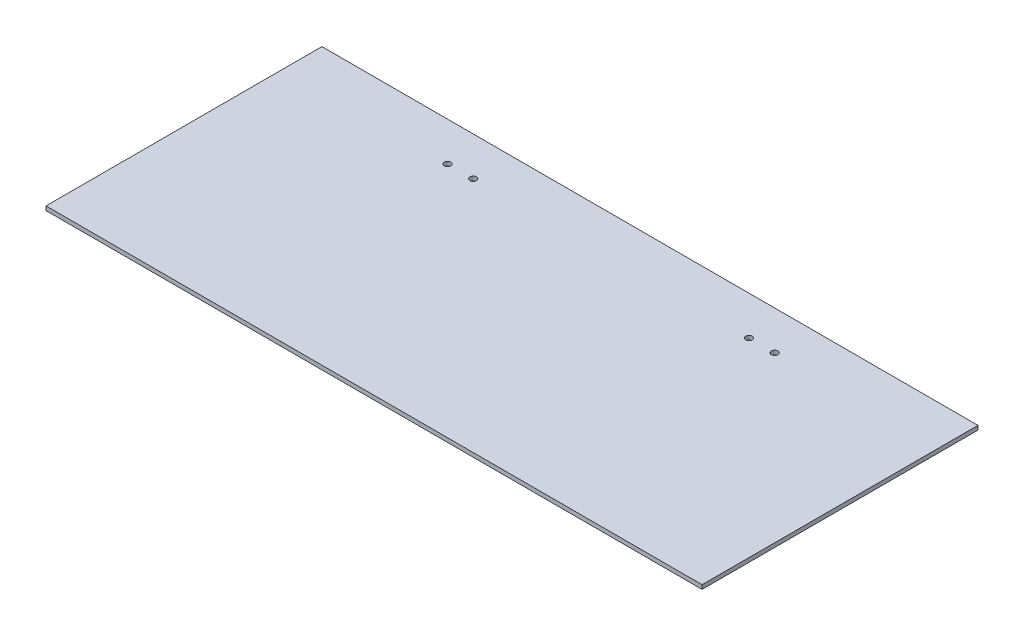
ISO-10303-21;
HEADER;
FILE_DESCRIPTION(('STEP AP214'),'2;1');
FILE_NAME('part.step','',(''),(''),'','','');
FILE_SCHEMA(('AUTOMOTIVE_DESIGN { 1 0 10303 214 1 1 1 1 }'));
ENDSEC;
DATA;
#1=APPLICATION_CONTEXT('core data for automotive mechanical design processes');
#2=APPLICATION_PROTOCOL_DEFINITION('international standard','automotive_design',2000,#1);
#3=PRODUCT_CONTEXT('',#1,'mechanical');
#4=PRODUCT('Part','Part','',(#3));
#5=PRODUCT_RELATED_PRODUCT_CATEGORY('part','',(#4));
#6=PRODUCT_DEFINITION_FORMATION('','',#4);
#7=PRODUCT_DEFINITION_CONTEXT('part definition',#1,'design');
#8=PRODUCT_DEFINITION('design','',#6,#7);
#9=PRODUCT_DEFINITION_SHAPE('','',#8);
#10=(LENGTH_UNIT() NAMED_UNIT(*) SI_UNIT(.MILLI.,.METRE.));
#11=(NAMED_UNIT(*) PLANE_ANGLE_UNIT() SI_UNIT($,.RADIAN.));
#12=(NAMED_UNIT(*) SI_UNIT($,.STERADIAN.) SOLID_ANGLE_UNIT());
#13=UNCERTAINTY_MEASURE_WITH_UNIT(LENGTH_MEASURE(1.E-05),#10,'distance_accuracy_value','');
#14=(GEOMETRIC_REPRESENTATION_CONTEXT(3) GLOBAL_UNCERTAINTY_ASSIGNED_CONTEXT((#13)) GLOBAL_UNIT_ASSIGNED_CONTEXT((#10,
#11,#12)) REPRESENTATION_CONTEXT('',''));
#15=CARTESIAN_POINT('',(0.,0.,0.));
#16=DIRECTION('',(0.,0.,1.));
#17=DIRECTION('',(1.,0.,0.));
#18=AXIS2_PLACEMENT_3D('',#15,#16,#17);
#19=CARTESIAN_POINT('',(-254.79375,3.175,107.15625));
#20=DIRECTION('',(1.,0.,0.));
#21=DIRECTION('',(0.,0.,-1.));
#22=AXIS2_PLACEMENT_3D('',#19,#20,#21);
#23=PLANE('',#22);
#24=DIRECTION('',(0.,0.,1.));
#25=VECTOR('',#24,1.);
#26=CARTESIAN_POINT('',(-254.79375,0.,107.15625));
#27=LINE('',#26,#25);
#28=CARTESIAN_POINT('',(-254.79375,0.,-107.15625));
#29=VERTEX_POINT('',#28);
#30=CARTESIAN_POINT('',(-254.79375,0.,107.15625));
#31=VERTEX_POINT('',#30);
#32=EDGE_CURVE('E96',#29,#31,#27,.T.);
#33=ORIENTED_EDGE('',*,*,#32,.T.);
#34=DIRECTION('',(0.,-1.,0.));
#35=VECTOR('',#34,1.);
#36=CARTESIAN_POINT('',(-254.79375,3.175,107.15625));
#37=LINE('',#36,#35);
#38=CARTESIAN_POINT('',(-254.79375,3.175,107.15625));
#39=VERTEX_POINT('',#38);
#40=EDGE_CURVE('E11',#39,#31,#37,.T.);
#41=ORIENTED_EDGE('',*,*,#40,.F.);
#42=DIRECTION('',(0.,0.,1.));
#43=VECTOR('',#42,1.);
#44=CARTESIAN_POINT('',(-254.79375,3.175,107.15625));
#45=LINE('',#44,#43);
#46=CARTESIAN_POINT('',(-254.79375,3.175,-107.15625));
#47=VERTEX_POINT('',#46);
#48=EDGE_CURVE('E84',#47,#39,#45,.T.);
#49=ORIENTED_EDGE('',*,*,#48,.F.);
#50=DIRECTION('',(0.,-1.,0.));
#51=VECTOR('',#50,1.);
#52=CARTESIAN_POINT('',(-254.79375,3.175,-107.15625));
#53=LINE('',#52,#51);
#54=EDGE_CURVE('E92',#47,#29,#53,.T.);
#55=ORIENTED_EDGE('',*,*,#54,.T.);
#56=EDGE_LOOP('',(#33,#41,#49,#55));
#57=FACE_BOUND('',#56,.T.);
#58=ADVANCED_FACE('F33',(#57),#23,.F.);
#59=CARTESIAN_POINT('',(-254.79375,3.175,107.15625));
#60=DIRECTION('',(0.,0.,-1.));
#61=DIRECTION('',(-1.,0.,0.));
#62=AXIS2_PLACEMENT_3D('',#59,#60,#61);
#63=PLANE('',#62);
#64=DIRECTION('',(1.,0.,0.));
#65=VECTOR('',#64,1.);
#66=CARTESIAN_POINT('',(-254.79375,0.,107.15625));
#67=LINE('',#66,#65);
#68=CARTESIAN_POINT('',(254.79375,0.,107.15625));
#69=VERTEX_POINT('',#68);
#70=EDGE_CURVE('E88',#31,#69,#67,.T.);
#71=ORIENTED_EDGE('',*,*,#70,.T.);
#72=DIRECTION('',(0.,-1.,0.));
#73=VECTOR('',#72,1.);
#74=CARTESIAN_POINT('',(254.79375,3.175,107.15625));
#75=LINE('',#74,#73);
#76=CARTESIAN_POINT('',(254.79375,3.175,107.15625));
#77=VERTEX_POINT('',#76);
#78=EDGE_CURVE('E41',#77,#69,#75,.T.);
#79=ORIENTED_EDGE('',*,*,#78,.F.);
#80=DIRECTION('',(1.,0.,0.));
#81=VECTOR('',#80,1.);
#82=CARTESIAN_POINT('',(-254.79375,3.175,107.15625));
#83=LINE('',#82,#81);
#84=EDGE_CURVE('E79',#39,#77,#83,.T.);
#85=ORIENTED_EDGE('',*,*,#84,.F.);
#86=ORIENTED_EDGE('',*,*,#40,.T.);
#87=EDGE_LOOP('',(#71,#79,#85,#86));
#88=FACE_BOUND('',#87,.T.);
#89=ADVANCED_FACE('F87',(#88),#63,.F.);
#90=CARTESIAN_POINT('',(254.79375,3.175,107.15625));
#91=DIRECTION('',(-1.,0.,0.));
#92=DIRECTION('',(0.,0.,1.));
#93=AXIS2_PLACEMENT_3D('',#90,#91,#92);
#94=PLANE('',#93);
#95=DIRECTION('',(0.,0.,-1.));
#96=VECTOR('',#95,1.);
#97=CARTESIAN_POINT('',(254.79375,0.,107.15625));
#98=LINE('',#97,#96);
#99=CARTESIAN_POINT('',(254.79375,0.,-107.15625));
#100=VERTEX_POINT('',#99);
#101=EDGE_CURVE('E66',#69,#100,#98,.T.);
#102=ORIENTED_EDGE('',*,*,#101,.T.);
#103=DIRECTION('',(0.,-1.,0.));
#104=VECTOR('',#103,1.);
#105=CARTESIAN_POINT('',(254.79375,3.175,-107.15625));
#106=LINE('',#105,#104);
#107=CARTESIAN_POINT('',(254.79375,3.175,-107.15625));
#108=VERTEX_POINT('',#107);
#109=EDGE_CURVE('E89',#108,#100,#106,.T.);
#110=ORIENTED_EDGE('',*,*,#109,.F.);
#111=DIRECTION('',(0.,0.,-1.));
#112=VECTOR('',#111,1.);
#113=CARTESIAN_POINT('',(254.79375,3.175,107.15625));
#114=LINE('',#113,#112);
#115=EDGE_CURVE('E82',#77,#108,#114,.T.);
#116=ORIENTED_EDGE('',*,*,#115,.F.);
#117=ORIENTED_EDGE('',*,*,#78,.T.);
#118=EDGE_LOOP('',(#102,#110,#116,#117));
#119=FACE_BOUND('',#118,.T.);
#120=ADVANCED_FACE('F90',(#119),#94,.F.);
#121=CARTESIAN_POINT('',(-254.79375,3.175,-107.15625));
#122=DIRECTION('',(0.,0.,1.));
#123=DIRECTION('',(1.,0.,0.));
#124=AXIS2_PLACEMENT_3D('',#121,#122,#123);
#125=PLANE('',#124);
#126=DIRECTION('',(-1.,0.,0.));
#127=VECTOR('',#126,1.);
#128=CARTESIAN_POINT('',(-254.79375,0.,-107.15625));
#129=LINE('',#128,#127);
#130=EDGE_CURVE('E72',#100,#29,#129,.T.);
#131=ORIENTED_EDGE('',*,*,#130,.T.);
#132=ORIENTED_EDGE('',*,*,#54,.F.);
#133=DIRECTION('',(-1.,0.,0.));
#134=VECTOR('',#133,1.);
#135=CARTESIAN_POINT('',(-254.79375,3.175,-107.15625));
#136=LINE('',#135,#134);
#137=EDGE_CURVE('E49',#108,#47,#136,.T.);
#138=ORIENTED_EDGE('',*,*,#137,.F.);
#139=ORIENTED_EDGE('',*,*,#109,.T.);
#140=EDGE_LOOP('',(#131,#132,#138,#139));
#141=FACE_BOUND('',#140,.T.);
#142=ADVANCED_FACE('F104',(#141),#125,.F.);
#143=CARTESIAN_POINT('',(0.,3.175,0.));
#144=DIRECTION('',(0.,-1.,0.));
#145=DIRECTION('',(0.,0.,-1.));
#146=AXIS2_PLACEMENT_3D('',#143,#144,#145);
#147=PLANE('',#146);
#148=CARTESIAN_POINT('',(127.,3.175,-76.99375));
#149=DIRECTION('',(0.,1.,0.));
#150=DIRECTION('',(0.,0.,1.));
#151=AXIS2_PLACEMENT_3D('',#148,#149,#150);
#152=CIRCLE('',#151,2.53999999999998);
#153=CARTESIAN_POINT('',(127.,3.175,-74.45375));
#154=VERTEX_POINT('',#153);
#155=EDGE_CURVE('E128',#154,#154,#152,.T.);
#156=ORIENTED_EDGE('',*,*,#155,.F.);
#157=EDGE_LOOP('',(#156));
#158=FACE_BOUND('',#157,.T.);
#159=CARTESIAN_POINT('',(107.15625,3.175,-76.99375));
#160=DIRECTION('',(0.,1.,0.));
#161=DIRECTION('',(0.,0.,1.));
#162=AXIS2_PLACEMENT_3D('',#159,#160,#161);
#163=CIRCLE('',#162,2.53999999999999);
#164=CARTESIAN_POINT('',(107.15625,3.175,-74.45375));
#165=VERTEX_POINT('',#164);
#166=EDGE_CURVE('E122',#165,#165,#163,.T.);
#167=ORIENTED_EDGE('',*,*,#166,.F.);
#168=EDGE_LOOP('',(#167));
#169=FACE_BOUND('',#168,.T.);
#170=CARTESIAN_POINT('',(-107.15625,3.175,-76.99375));
#171=DIRECTION('',(0.,1.,0.));
#172=DIRECTION('',(0.,0.,1.));
#173=AXIS2_PLACEMENT_3D('',#170,#171,#172);
#174=CIRCLE('',#173,2.53999999999999);
#175=CARTESIAN_POINT('',(-107.15625,3.175,-74.45375));
#176=VERTEX_POINT('',#175);
#177=EDGE_CURVE('E116',#176,#176,#174,.T.);
#178=ORIENTED_EDGE('',*,*,#177,.F.);
#179=EDGE_LOOP('',(#178));
#180=FACE_BOUND('',#179,.T.);
#181=CARTESIAN_POINT('',(-127.,3.175,-76.99375));
#182=DIRECTION('',(0.,1.,0.));
#183=DIRECTION('',(0.,0.,1.));
#184=AXIS2_PLACEMENT_3D('',#181,#182,#183);
#185=CIRCLE('',#184,2.53999999999998);
#186=CARTESIAN_POINT('',(-127.,3.175,-74.45375));
#187=VERTEX_POINT('',#186);
#188=EDGE_CURVE('E110',#187,#187,#185,.T.);
#189=ORIENTED_EDGE('',*,*,#188,.F.);
#190=EDGE_LOOP('',(#189));
#191=FACE_BOUND('',#190,.T.);
#192=ORIENTED_EDGE('',*,*,#48,.T.);
#193=ORIENTED_EDGE('',*,*,#84,.T.);
#194=ORIENTED_EDGE('',*,*,#115,.T.);
#195=ORIENTED_EDGE('',*,*,#137,.T.);
#196=EDGE_LOOP('',(#192,#193,#194,#195));
#197=FACE_BOUND('',#196,.T.);
#198=ADVANCED_FACE('F80',(#158,#169,#180,#191,#197),#147,.F.);
#199=CARTESIAN_POINT('',(0.,0.,0.));
#200=DIRECTION('',(0.,-1.,0.));
#201=DIRECTION('',(0.,0.,-1.));
#202=AXIS2_PLACEMENT_3D('',#199,#200,#201);
#203=PLANE('',#202);
#204=CARTESIAN_POINT('',(127.,0.,-76.99375));
#205=DIRECTION('',(0.,1.,0.));
#206=DIRECTION('',(0.,0.,1.));
#207=AXIS2_PLACEMENT_3D('',#204,#205,#206);
#208=CIRCLE('',#207,2.53999999999998);
#209=CARTESIAN_POINT('',(127.,0.,-74.45375));
#210=VERTEX_POINT('',#209);
#211=EDGE_CURVE('E125',#210,#210,#208,.T.);
#212=ORIENTED_EDGE('',*,*,#211,.T.);
#213=EDGE_LOOP('',(#212));
#214=FACE_BOUND('',#213,.T.);
#215=CARTESIAN_POINT('',(107.15625,0.,-76.99375));
#216=DIRECTION('',(0.,1.,0.));
#217=DIRECTION('',(0.,0.,1.));
#218=AXIS2_PLACEMENT_3D('',#215,#216,#217);
#219=CIRCLE('',#218,2.53999999999999);
#220=CARTESIAN_POINT('',(107.15625,0.,-74.45375));
#221=VERTEX_POINT('',#220);
#222=EDGE_CURVE('E119',#221,#221,#219,.T.);
#223=ORIENTED_EDGE('',*,*,#222,.T.);
#224=EDGE_LOOP('',(#223));
#225=FACE_BOUND('',#224,.T.);
#226=CARTESIAN_POINT('',(-107.15625,0.,-76.99375));
#227=DIRECTION('',(0.,1.,0.));
#228=DIRECTION('',(0.,0.,1.));
#229=AXIS2_PLACEMENT_3D('',#226,#227,#228);
#230=CIRCLE('',#229,2.53999999999999);
#231=CARTESIAN_POINT('',(-107.15625,0.,-74.45375));
#232=VERTEX_POINT('',#231);
#233=EDGE_CURVE('E113',#232,#232,#230,.T.);
#234=ORIENTED_EDGE('',*,*,#233,.T.);
#235=EDGE_LOOP('',(#234));
#236=FACE_BOUND('',#235,.T.);
#237=CARTESIAN_POINT('',(-127.,0.,-76.99375));
#238=DIRECTION('',(0.,1.,0.));
#239=DIRECTION('',(0.,0.,1.));
#240=AXIS2_PLACEMENT_3D('',#237,#238,#239);
#241=CIRCLE('',#240,2.53999999999998);
#242=CARTESIAN_POINT('',(-127.,0.,-74.45375));
#243=VERTEX_POINT('',#242);
#244=EDGE_CURVE('E99',#243,#243,#241,.T.);
#245=ORIENTED_EDGE('',*,*,#244,.T.);
#246=EDGE_LOOP('',(#245));
#247=FACE_BOUND('',#246,.T.);
#248=ORIENTED_EDGE('',*,*,#32,.F.);
#249=ORIENTED_EDGE('',*,*,#130,.F.);
#250=ORIENTED_EDGE('',*,*,#101,.F.);
#251=ORIENTED_EDGE('',*,*,#70,.F.);
#252=EDGE_LOOP('',(#248,#249,#250,#251));
#253=FACE_BOUND('',#252,.T.);
#254=ADVANCED_FACE('F107',(#214,#225,#236,#247,#253),#203,.T.);
#255=CARTESIAN_POINT('',(-127.,0.,-76.99375));
#256=DIRECTION('',(0.,1.,0.));
#257=DIRECTION('',(0.,0.,1.));
#258=AXIS2_PLACEMENT_3D('',#255,#256,#257);
#259=CYLINDRICAL_SURFACE('',#258,2.53999999999998);
#260=ORIENTED_EDGE('',*,*,#244,.F.);
#261=EDGE_LOOP('',(#260));
#262=FACE_BOUND('',#261,.T.);
#263=ORIENTED_EDGE('',*,*,#188,.T.);
#264=EDGE_LOOP('',(#263));
#265=FACE_BOUND('',#264,.T.);
#266=ADVANCED_FACE('F152',(#262,#265),#259,.F.);
#267=CARTESIAN_POINT('',(-107.15625,0.,-76.99375));
#268=DIRECTION('',(0.,1.,0.));
#269=DIRECTION('',(0.,0.,1.));
#270=AXIS2_PLACEMENT_3D('',#267,#268,#269);
#271=CYLINDRICAL_SURFACE('',#270,2.53999999999999);
#272=ORIENTED_EDGE('',*,*,#233,.F.);
#273=EDGE_LOOP('',(#272));
#274=FACE_BOUND('',#273,.T.);
#275=ORIENTED_EDGE('',*,*,#177,.T.);
#276=EDGE_LOOP('',(#275));
#277=FACE_BOUND('',#276,.T.);
#278=ADVANCED_FACE('F154',(#274,#277),#271,.F.);
#279=CARTESIAN_POINT('',(107.15625,0.,-76.99375));
#280=DIRECTION('',(0.,1.,0.));
#281=DIRECTION('',(0.,0.,1.));
#282=AXIS2_PLACEMENT_3D('',#279,#280,#281);
#283=CYLINDRICAL_SURFACE('',#282,2.53999999999999);
#284=ORIENTED_EDGE('',*,*,#222,.F.);
#285=EDGE_LOOP('',(#284));
#286=FACE_BOUND('',#285,.T.);
#287=ORIENTED_EDGE('',*,*,#166,.T.);
#288=EDGE_LOOP('',(#287));
#289=FACE_BOUND('',#288,.T.);
#290=ADVANCED_FACE('F139',(#286,#289),#283,.F.);
#291=CARTESIAN_POINT('',(127.,0.,-76.99375));
#292=DIRECTION('',(0.,1.,0.));
#293=DIRECTION('',(0.,0.,1.));
#294=AXIS2_PLACEMENT_3D('',#291,#292,#293);
#295=CYLINDRICAL_SURFACE('',#294,2.53999999999998);
#296=ORIENTED_EDGE('',*,*,#211,.F.);
#297=EDGE_LOOP('',(#296));
#298=FACE_BOUND('',#297,.T.);
#299=ORIENTED_EDGE('',*,*,#155,.T.);
#300=EDGE_LOOP('',(#299));
#301=FACE_BOUND('',#300,.T.);
#302=ADVANCED_FACE('F136',(#298,#301),#295,.F.);
#303=CLOSED_SHELL('',(#58,#89,#120,#142,#198,#254,#266,#278,#290,#302));
#304=MANIFOLD_SOLID_BREP('B2',#303);
#305=ADVANCED_BREP_SHAPE_REPRESENTATION('',(#18,#304),#14);
#306=SHAPE_DEFINITION_REPRESENTATION(#9,#305);
ENDSEC;
END-ISO-10303-21;
